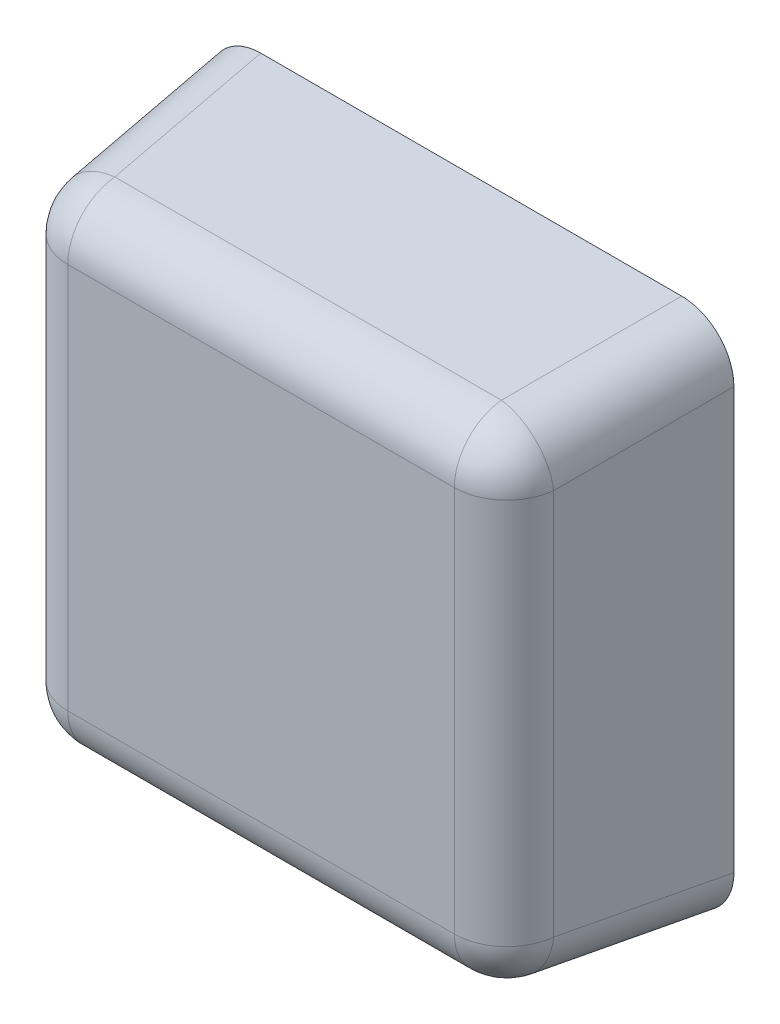
ISO-10303-21;
HEADER;
FILE_DESCRIPTION(('STEP AP214'),'2;1');
FILE_NAME('part.step','',(''),(''),'','','');
FILE_SCHEMA(('AUTOMOTIVE_DESIGN { 1 0 10303 214 1 1 1 1 }'));
ENDSEC;
DATA;
#1=APPLICATION_CONTEXT('core data for automotive mechanical design processes');
#2=APPLICATION_PROTOCOL_DEFINITION('international standard','automotive_design',2000,#1);
#3=PRODUCT_CONTEXT('',#1,'mechanical');
#4=PRODUCT('Part','Part','',(#3));
#5=PRODUCT_RELATED_PRODUCT_CATEGORY('part','',(#4));
#6=PRODUCT_DEFINITION_FORMATION('','',#4);
#7=PRODUCT_DEFINITION_CONTEXT('part definition',#1,'design');
#8=PRODUCT_DEFINITION('design','',#6,#7);
#9=PRODUCT_DEFINITION_SHAPE('','',#8);
#10=(LENGTH_UNIT() NAMED_UNIT(*) SI_UNIT(.MILLI.,.METRE.));
#11=(NAMED_UNIT(*) PLANE_ANGLE_UNIT() SI_UNIT($,.RADIAN.));
#12=(NAMED_UNIT(*) SI_UNIT($,.STERADIAN.) SOLID_ANGLE_UNIT());
#13=UNCERTAINTY_MEASURE_WITH_UNIT(LENGTH_MEASURE(1.E-05),#10,'distance_accuracy_value','');
#14=(GEOMETRIC_REPRESENTATION_CONTEXT(3) GLOBAL_UNCERTAINTY_ASSIGNED_CONTEXT((#13)) GLOBAL_UNIT_ASSIGNED_CONTEXT((#10,
#11,#12)) REPRESENTATION_CONTEXT('',''));
#15=CARTESIAN_POINT('',(0.,0.,0.));
#16=DIRECTION('',(0.,0.,1.));
#17=DIRECTION('',(1.,0.,0.));
#18=AXIS2_PLACEMENT_3D('',#15,#16,#17);
#19=CARTESIAN_POINT('',(0.,0.,0.));
#20=DIRECTION('',(-0.994521895368273,0.,0.104528463267653));
#21=DIRECTION('',(0.104528463267653,0.,0.994521895368273));
#22=AXIS2_PLACEMENT_3D('',#19,#20,#21);
#23=PLANE('',#22);
#24=DIRECTION('',(0.,-1.,0.));
#25=VECTOR('',#24,1.);
#26=CARTESIAN_POINT('',(0.,0.,0.));
#27=LINE('',#26,#25);
#28=CARTESIAN_POINT('',(0.,-1.26304280711771,0.));
#29=VERTEX_POINT('',#28);
#30=CARTESIAN_POINT('',(0.,-11.4369571928823,0.));
#31=VERTEX_POINT('',#30);
#32=EDGE_CURVE('E198',#29,#31,#27,.T.);
#33=ORIENTED_EDGE('',*,*,#32,.T.);
#34=DIRECTION('',(0.103962051184498,0.103962051184498,0.989132844377854));
#35=VECTOR('',#34,1.);
#36=CARTESIAN_POINT('',(0.123611869521211,-11.3133453233611,1.1760883774926));
#37=LINE('',#36,#35);
#38=CARTESIAN_POINT('',(0.414399844290188,-11.0225573485921,3.94275114834992));
#39=VERTEX_POINT('',#38);
#40=EDGE_CURVE('E50',#31,#39,#37,.T.);
#41=ORIENTED_EDGE('',*,*,#40,.T.);
#42=DIRECTION('',(0.,-1.,0.));
#43=VECTOR('',#42,1.);
#44=CARTESIAN_POINT('',(0.414399844290186,-0.533929515149637,3.94275114834992));
#45=LINE('',#44,#43);
#46=CARTESIAN_POINT('',(0.414399844290186,-1.67744265140789,3.94275114834992));
#47=VERTEX_POINT('',#46);
#48=EDGE_CURVE('E55',#39,#47,#45,.F.);
#49=ORIENTED_EDGE('',*,*,#48,.T.);
#50=DIRECTION('',(0.103962051184498,-0.103962051184498,0.989132844377854));
#51=VECTOR('',#50,1.);
#52=CARTESIAN_POINT('',(-0.0136511031771894,-1.24939170394052,-0.129881570829977));
#53=LINE('',#52,#51);
#54=EDGE_CURVE('E167',#47,#29,#53,.F.);
#55=ORIENTED_EDGE('',*,*,#54,.T.);
#56=EDGE_LOOP('',(#33,#41,#49,#55));
#57=FACE_BOUND('',#56,.T.);
#58=ADVANCED_FACE('F33',(#57),#23,.T.);
#59=CARTESIAN_POINT('',(0.,-12.7,0.));
#60=DIRECTION('',(0.,-0.994521895368273,0.104528463267653));
#61=DIRECTION('',(0.,-0.104528463267653,-0.994521895368273));
#62=AXIS2_PLACEMENT_3D('',#59,#60,#61);
#63=PLANE('',#62);
#64=DIRECTION('',(1.,0.,0.));
#65=VECTOR('',#64,1.);
#66=CARTESIAN_POINT('',(0.,-12.7,0.));
#67=LINE('',#66,#65);
#68=CARTESIAN_POINT('',(1.26304280711771,-12.7,0.));
#69=VERTEX_POINT('',#68);
#70=CARTESIAN_POINT('',(11.4369571928823,-12.7,0.));
#71=VERTEX_POINT('',#70);
#72=EDGE_CURVE('E200',#69,#71,#67,.T.);
#73=ORIENTED_EDGE('',*,*,#72,.T.);
#74=DIRECTION('',(-0.103962051184498,0.103962051184498,0.989132844377854));
#75=VECTOR('',#74,1.);
#76=CARTESIAN_POINT('',(11.3133453233611,-12.5763881304788,1.1760883774926));
#77=LINE('',#76,#75);
#78=CARTESIAN_POINT('',(11.0225573485921,-12.2856001557098,3.94275114834992));
#79=VERTEX_POINT('',#78);
#80=EDGE_CURVE('E165',#71,#79,#77,.T.);
#81=ORIENTED_EDGE('',*,*,#80,.T.);
#82=DIRECTION('',(1.,0.,0.));
#83=VECTOR('',#82,1.);
#84=CARTESIAN_POINT('',(0.533929515149638,-12.2856001557098,3.94275114834992));
#85=LINE('',#84,#83);
#86=CARTESIAN_POINT('',(1.67744265140789,-12.2856001557098,3.94275114834992));
#87=VERTEX_POINT('',#86);
#88=EDGE_CURVE('E163',#79,#87,#85,.F.);
#89=ORIENTED_EDGE('',*,*,#88,.T.);
#90=DIRECTION('',(0.103962051184498,0.103962051184498,0.989132844377854));
#91=VECTOR('',#90,1.);
#92=CARTESIAN_POINT('',(1.24939170394052,-12.7136511031772,-0.129881570829977));
#93=LINE('',#92,#91);
#94=EDGE_CURVE('E161',#87,#69,#93,.F.);
#95=ORIENTED_EDGE('',*,*,#94,.T.);
#96=EDGE_LOOP('',(#73,#81,#89,#95));
#97=FACE_BOUND('',#96,.T.);
#98=ADVANCED_FACE('F253',(#97),#63,.T.);
#99=CARTESIAN_POINT('',(12.7,0.,0.));
#100=DIRECTION('',(0.994521895368273,0.,0.104528463267653));
#101=DIRECTION('',(0.104528463267653,0.,-0.994521895368273));
#102=AXIS2_PLACEMENT_3D('',#99,#100,#101);
#103=PLANE('',#102);
#104=DIRECTION('',(0.,1.,0.));
#105=VECTOR('',#104,1.);
#106=CARTESIAN_POINT('',(12.2856001557098,-12.1660704848504,3.94275114834992));
#107=LINE('',#106,#105);
#108=CARTESIAN_POINT('',(12.2856001557098,-1.67744265140789,3.94275114834992));
#109=VERTEX_POINT('',#108);
#110=CARTESIAN_POINT('',(12.2856001557098,-11.0225573485921,3.94275114834992));
#111=VERTEX_POINT('',#110);
#112=EDGE_CURVE('E157',#109,#111,#107,.F.);
#113=ORIENTED_EDGE('',*,*,#112,.T.);
#114=DIRECTION('',(-0.103962051184498,0.103962051184498,0.989132844377854));
#115=VECTOR('',#114,1.);
#116=CARTESIAN_POINT('',(12.5763881304788,-11.3133453233611,1.1760883774926));
#117=LINE('',#116,#115);
#118=CARTESIAN_POINT('',(12.7,-11.4369571928823,0.));
#119=VERTEX_POINT('',#118);
#120=EDGE_CURVE('E159',#111,#119,#117,.F.);
#121=ORIENTED_EDGE('',*,*,#120,.T.);
#122=DIRECTION('',(0.,1.,0.));
#123=VECTOR('',#122,1.);
#124=CARTESIAN_POINT('',(12.7,0.,0.));
#125=LINE('',#124,#123);
#126=CARTESIAN_POINT('',(12.7,-1.26304280711771,0.));
#127=VERTEX_POINT('',#126);
#128=EDGE_CURVE('E204',#119,#127,#125,.T.);
#129=ORIENTED_EDGE('',*,*,#128,.T.);
#130=DIRECTION('',(-0.103962051184498,-0.103962051184498,0.989132844377854));
#131=VECTOR('',#130,1.);
#132=CARTESIAN_POINT('',(12.7136511031772,-1.24939170394052,-0.129881570829977));
#133=LINE('',#132,#131);
#134=EDGE_CURVE('E155',#127,#109,#133,.T.);
#135=ORIENTED_EDGE('',*,*,#134,.T.);
#136=EDGE_LOOP('',(#113,#121,#129,#135));
#137=FACE_BOUND('',#136,.T.);
#138=ADVANCED_FACE('F258',(#137),#103,.T.);
#139=CARTESIAN_POINT('',(0.,0.,0.));
#140=DIRECTION('',(0.,0.994521895368273,0.104528463267653));
#141=DIRECTION('',(0.,-0.104528463267653,0.994521895368273));
#142=AXIS2_PLACEMENT_3D('',#139,#140,#141);
#143=PLANE('',#142);
#144=DIRECTION('',(-1.,0.,0.));
#145=VECTOR('',#144,1.);
#146=CARTESIAN_POINT('',(0.,0.,0.));
#147=LINE('',#146,#145);
#148=CARTESIAN_POINT('',(11.4369571928823,0.,0.));
#149=VERTEX_POINT('',#148);
#150=CARTESIAN_POINT('',(1.26304280711771,0.,0.));
#151=VERTEX_POINT('',#150);
#152=EDGE_CURVE('E140',#149,#151,#147,.T.);
#153=ORIENTED_EDGE('',*,*,#152,.T.);
#154=DIRECTION('',(0.103962051184498,-0.103962051184498,0.989132844377854));
#155=VECTOR('',#154,1.);
#156=CARTESIAN_POINT('',(1.24939170394052,0.0136511031771896,-0.129881570829977));
#157=LINE('',#156,#155);
#158=CARTESIAN_POINT('',(1.67744265140789,-0.414399844290186,3.94275114834992));
#159=VERTEX_POINT('',#158);
#160=EDGE_CURVE('E153',#151,#159,#157,.T.);
#161=ORIENTED_EDGE('',*,*,#160,.T.);
#162=DIRECTION('',(-1.,0.,0.));
#163=VECTOR('',#162,1.);
#164=CARTESIAN_POINT('',(12.1660704848504,-0.414399844290186,3.94275114834992));
#165=LINE('',#164,#163);
#166=CARTESIAN_POINT('',(11.0225573485921,-0.414399844290186,3.94275114834992));
#167=VERTEX_POINT('',#166);
#168=EDGE_CURVE('E118',#159,#167,#165,.F.);
#169=ORIENTED_EDGE('',*,*,#168,.T.);
#170=DIRECTION('',(-0.103962051184498,-0.103962051184498,0.989132844377854));
#171=VECTOR('',#170,1.);
#172=CARTESIAN_POINT('',(11.3133453233611,-0.12361186952121,1.1760883774926));
#173=LINE('',#172,#171);
#174=EDGE_CURVE('E146',#167,#149,#173,.F.);
#175=ORIENTED_EDGE('',*,*,#174,.T.);
#176=EDGE_LOOP('',(#153,#161,#169,#175));
#177=FACE_BOUND('',#176,.T.);
#178=ADVANCED_FACE('F229',(#177),#143,.T.);
#179=CARTESIAN_POINT('',(0.,0.,5.08));
#180=DIRECTION('',(0.,0.,1.));
#181=DIRECTION('',(1.,0.,0.));
#182=AXIS2_PLACEMENT_3D('',#179,#180,#181);
#183=PLANE('',#182);
#184=DIRECTION('',(0.,-1.,0.));
#185=VECTOR('',#184,1.);
#186=CARTESIAN_POINT('',(11.0225573485921,-0.533929515149637,5.08));
#187=LINE('',#186,#185);
#188=CARTESIAN_POINT('',(11.0225573485921,-11.0225573485921,5.08));
#189=VERTEX_POINT('',#188);
#190=CARTESIAN_POINT('',(11.0225573485921,-1.67744265140789,5.08));
#191=VERTEX_POINT('',#190);
#192=EDGE_CURVE('E144',#189,#191,#187,.F.);
#193=ORIENTED_EDGE('',*,*,#192,.T.);
#194=DIRECTION('',(1.,0.,0.));
#195=VECTOR('',#194,1.);
#196=CARTESIAN_POINT('',(0.533929515149637,-1.67744265140789,5.08));
#197=LINE('',#196,#195);
#198=CARTESIAN_POINT('',(1.67744265140789,-1.67744265140789,5.08));
#199=VERTEX_POINT('',#198);
#200=EDGE_CURVE('E116',#191,#199,#197,.F.);
#201=ORIENTED_EDGE('',*,*,#200,.T.);
#202=DIRECTION('',(0.,1.,0.));
#203=VECTOR('',#202,1.);
#204=CARTESIAN_POINT('',(1.6774426514079,-12.1660704848504,5.08));
#205=LINE('',#204,#203);
#206=CARTESIAN_POINT('',(1.67744265140789,-11.0225573485921,5.08));
#207=VERTEX_POINT('',#206);
#208=EDGE_CURVE('E133',#199,#207,#205,.F.);
#209=ORIENTED_EDGE('',*,*,#208,.T.);
#210=DIRECTION('',(-1.,0.,0.));
#211=VECTOR('',#210,1.);
#212=CARTESIAN_POINT('',(12.1660704848504,-11.0225573485921,5.08));
#213=LINE('',#212,#211);
#214=EDGE_CURVE('E139',#207,#189,#213,.F.);
#215=ORIENTED_EDGE('',*,*,#214,.T.);
#216=EDGE_LOOP('',(#193,#201,#209,#215));
#217=FACE_BOUND('',#216,.T.);
#218=ADVANCED_FACE('F142',(#217),#183,.T.);
#219=CARTESIAN_POINT('',(0.,0.,0.));
#220=DIRECTION('',(0.,0.,1.));
#221=DIRECTION('',(1.,0.,0.));
#222=AXIS2_PLACEMENT_3D('',#219,#220,#221);
#223=PLANE('',#222);
#224=ORIENTED_EDGE('',*,*,#128,.F.);
#225=CARTESIAN_POINT('',(11.4230044849543,-11.4230044849543,0.));
#226=DIRECTION('',(0.,0.,1.));
#227=DIRECTION('',(0.707106781186548,-0.707106781186547,0.));
#228=AXIS2_PLACEMENT_3D('',#225,#226,#227);
#229=ELLIPSE('',#228,1.28395291615132,1.27);
#230=EDGE_CURVE('E11',#119,#71,#229,.F.);
#231=ORIENTED_EDGE('',*,*,#230,.T.);
#232=ORIENTED_EDGE('',*,*,#72,.F.);
#233=CARTESIAN_POINT('',(1.27699551504567,-11.4230044849543,0.));
#234=DIRECTION('',(0.,0.,1.));
#235=DIRECTION('',(-0.707106781186547,-0.707106781186548,0.));
#236=AXIS2_PLACEMENT_3D('',#233,#234,#235);
#237=ELLIPSE('',#236,1.28395291615132,1.27);
#238=EDGE_CURVE('E42',#69,#31,#237,.F.);
#239=ORIENTED_EDGE('',*,*,#238,.T.);
#240=ORIENTED_EDGE('',*,*,#32,.F.);
#241=CARTESIAN_POINT('',(1.27699551504567,-1.27699551504567,0.));
#242=DIRECTION('',(0.,0.,1.));
#243=DIRECTION('',(-0.707106781186548,0.707106781186547,0.));
#244=AXIS2_PLACEMENT_3D('',#241,#242,#243);
#245=ELLIPSE('',#244,1.28395291615132,1.27);
#246=EDGE_CURVE('E173',#29,#151,#245,.F.);
#247=ORIENTED_EDGE('',*,*,#246,.T.);
#248=ORIENTED_EDGE('',*,*,#152,.F.);
#249=CARTESIAN_POINT('',(11.4230044849543,-1.27699551504567,0.));
#250=DIRECTION('',(0.,0.,1.));
#251=DIRECTION('',(0.707106781186547,0.707106781186548,0.));
#252=AXIS2_PLACEMENT_3D('',#249,#250,#251);
#253=ELLIPSE('',#252,1.28395291615132,1.27);
#254=EDGE_CURVE('E171',#149,#127,#253,.F.);
#255=ORIENTED_EDGE('',*,*,#254,.T.);
#256=EDGE_LOOP('',(#224,#231,#232,#239,#240,#247,#248,#255));
#257=FACE_BOUND('',#256,.T.);
#258=ADVANCED_FACE('F236',(#257),#223,.F.);
#259=CARTESIAN_POINT('',(11.3133453233611,-11.3133453233611,1.04333722914268));
#260=DIRECTION('',(0.103962051184498,-0.103962051184498,-0.989132844377854));
#261=DIRECTION('',(-0.994521895368273,0.,-0.104528463267653));
#262=AXIS2_PLACEMENT_3D('',#259,#260,#261);
#263=CYLINDRICAL_SURFACE('',#262,1.27);
#264=ORIENTED_EDGE('',*,*,#230,.F.);
#265=ORIENTED_EDGE('',*,*,#120,.F.);
#266=CARTESIAN_POINT('',(11.0225573485921,-11.0225573485921,3.81));
#267=DIRECTION('',(-0.103962051184498,0.103962051184498,0.989132844377854));
#268=DIRECTION('',(0.994521895368273,0.,0.104528463267654));
#269=AXIS2_PLACEMENT_3D('',#266,#267,#268);
#270=CIRCLE('',#269,1.27);
#271=EDGE_CURVE('E37',#79,#111,#270,.T.);
#272=ORIENTED_EDGE('',*,*,#271,.F.);
#273=ORIENTED_EDGE('',*,*,#80,.F.);
#274=EDGE_LOOP('',(#264,#265,#272,#273));
#275=FACE_BOUND('',#274,.T.);
#276=ADVANCED_FACE('F35',(#275),#263,.T.);
#277=CARTESIAN_POINT('',(0.,-11.0225573485921,3.81));
#278=DIRECTION('',(1.,0.,0.));
#279=DIRECTION('',(0.,0.,-1.));
#280=AXIS2_PLACEMENT_3D('',#277,#278,#279);
#281=CYLINDRICAL_SURFACE('',#280,1.27);
#282=CARTESIAN_POINT('',(1.67744265140789,-11.0225573485921,3.81));
#283=DIRECTION('',(-1.,0.,0.));
#284=DIRECTION('',(0.,0.,1.));
#285=AXIS2_PLACEMENT_3D('',#282,#283,#284);
#286=CIRCLE('',#285,1.27);
#287=EDGE_CURVE('E190',#87,#207,#286,.T.);
#288=ORIENTED_EDGE('',*,*,#287,.F.);
#289=ORIENTED_EDGE('',*,*,#88,.F.);
#290=CARTESIAN_POINT('',(11.0225573485921,-11.0225573485921,3.81));
#291=DIRECTION('',(1.,0.,0.));
#292=DIRECTION('',(0.,1.,0.));
#293=AXIS2_PLACEMENT_3D('',#290,#291,#292);
#294=CIRCLE('',#293,1.27);
#295=EDGE_CURVE('E192',#189,#79,#294,.T.);
#296=ORIENTED_EDGE('',*,*,#295,.F.);
#297=ORIENTED_EDGE('',*,*,#214,.F.);
#298=EDGE_LOOP('',(#288,#289,#296,#297));
#299=FACE_BOUND('',#298,.T.);
#300=ADVANCED_FACE('F213',(#299),#281,.T.);
#301=CARTESIAN_POINT('',(1.24939170394052,-11.4506082960595,-0.262632719179897));
#302=DIRECTION('',(-0.103962051184498,-0.103962051184498,-0.989132844377854));
#303=DIRECTION('',(0.,0.994521895368273,-0.104528463267653));
#304=AXIS2_PLACEMENT_3D('',#301,#302,#303);
#305=CYLINDRICAL_SURFACE('',#304,1.27);
#306=ORIENTED_EDGE('',*,*,#238,.F.);
#307=ORIENTED_EDGE('',*,*,#94,.F.);
#308=CARTESIAN_POINT('',(1.67744265140789,-11.0225573485921,3.81));
#309=DIRECTION('',(0.103962051184498,0.103962051184498,0.989132844377854));
#310=DIRECTION('',(0.994521895368273,0.,-0.104528463267654));
#311=AXIS2_PLACEMENT_3D('',#308,#309,#310);
#312=CIRCLE('',#311,1.27);
#313=EDGE_CURVE('E187',#39,#87,#312,.T.);
#314=ORIENTED_EDGE('',*,*,#313,.F.);
#315=ORIENTED_EDGE('',*,*,#40,.F.);
#316=EDGE_LOOP('',(#306,#307,#314,#315));
#317=FACE_BOUND('',#316,.T.);
#318=ADVANCED_FACE('F241',(#317),#305,.T.);
#319=CARTESIAN_POINT('',(11.0225573485921,-11.0225573485921,3.81));
#320=DIRECTION('',(0.,0.,1.));
#321=DIRECTION('',(1.,0.,0.));
#322=AXIS2_PLACEMENT_3D('',#319,#320,#321);
#323=SPHERICAL_SURFACE('',#322,1.27);
#324=ORIENTED_EDGE('',*,*,#295,.T.);
#325=ORIENTED_EDGE('',*,*,#271,.T.);
#326=CARTESIAN_POINT('',(11.0225573485921,-11.0225573485921,3.81));
#327=DIRECTION('',(0.,-1.,0.));
#328=DIRECTION('',(0.,0.,-1.));
#329=AXIS2_PLACEMENT_3D('',#326,#327,#328);
#330=CIRCLE('',#329,1.27);
#331=EDGE_CURVE('E184',#189,#111,#330,.F.);
#332=ORIENTED_EDGE('',*,*,#331,.F.);
#333=EDGE_LOOP('',(#324,#325,#332));
#334=FACE_BOUND('',#333,.T.);
#335=ADVANCED_FACE('F214',(#334),#323,.T.);
#336=CARTESIAN_POINT('',(1.67744265140789,-11.0225573485921,3.81));
#337=DIRECTION('',(0.,0.,1.));
#338=DIRECTION('',(0.,-1.,0.));
#339=AXIS2_PLACEMENT_3D('',#336,#337,#338);
#340=SPHERICAL_SURFACE('',#339,1.27);
#341=ORIENTED_EDGE('',*,*,#313,.T.);
#342=ORIENTED_EDGE('',*,*,#287,.T.);
#343=CARTESIAN_POINT('',(1.67744265140789,-11.0225573485921,3.81));
#344=DIRECTION('',(0.,-1.,0.));
#345=DIRECTION('',(0.,0.,-1.));
#346=AXIS2_PLACEMENT_3D('',#343,#344,#345);
#347=CIRCLE('',#346,1.27);
#348=EDGE_CURVE('E136',#39,#207,#347,.F.);
#349=ORIENTED_EDGE('',*,*,#348,.F.);
#350=EDGE_LOOP('',(#341,#342,#349));
#351=FACE_BOUND('',#350,.T.);
#352=ADVANCED_FACE('F243',(#351),#340,.T.);
#353=CARTESIAN_POINT('',(11.3133453233611,-1.38665467663892,1.04333722914268));
#354=DIRECTION('',(0.103962051184498,0.103962051184498,-0.989132844377854));
#355=DIRECTION('',(0.,0.994521895368273,0.104528463267653));
#356=AXIS2_PLACEMENT_3D('',#353,#354,#355);
#357=CYLINDRICAL_SURFACE('',#356,1.27);
#358=ORIENTED_EDGE('',*,*,#254,.F.);
#359=ORIENTED_EDGE('',*,*,#174,.F.);
#360=CARTESIAN_POINT('',(11.0225573485921,-1.67744265140789,3.81));
#361=DIRECTION('',(-0.103962051184498,-0.103962051184498,0.989132844377854));
#362=DIRECTION('',(0.,-0.994521895368273,-0.104528463267654));
#363=AXIS2_PLACEMENT_3D('',#360,#361,#362);
#364=CIRCLE('',#363,1.27);
#365=EDGE_CURVE('E180',#109,#167,#364,.T.);
#366=ORIENTED_EDGE('',*,*,#365,.F.);
#367=ORIENTED_EDGE('',*,*,#134,.F.);
#368=EDGE_LOOP('',(#358,#359,#366,#367));
#369=FACE_BOUND('',#368,.T.);
#370=ADVANCED_FACE('F226',(#369),#357,.T.);
#371=CARTESIAN_POINT('',(11.0225573485921,0.,3.81));
#372=DIRECTION('',(0.,1.,0.));
#373=DIRECTION('',(-1.,0.,0.));
#374=AXIS2_PLACEMENT_3D('',#371,#372,#373);
#375=CYLINDRICAL_SURFACE('',#374,1.27);
#376=ORIENTED_EDGE('',*,*,#331,.T.);
#377=ORIENTED_EDGE('',*,*,#112,.F.);
#378=CARTESIAN_POINT('',(11.0225573485921,-1.67744265140789,3.81));
#379=DIRECTION('',(0.,1.,0.));
#380=DIRECTION('',(-1.,0.,0.));
#381=AXIS2_PLACEMENT_3D('',#378,#379,#380);
#382=CIRCLE('',#381,1.27);
#383=EDGE_CURVE('E130',#191,#109,#382,.T.);
#384=ORIENTED_EDGE('',*,*,#383,.F.);
#385=ORIENTED_EDGE('',*,*,#192,.F.);
#386=EDGE_LOOP('',(#376,#377,#384,#385));
#387=FACE_BOUND('',#386,.T.);
#388=ADVANCED_FACE('F217',(#387),#375,.T.);
#389=CARTESIAN_POINT('',(1.67744265140789,0.,3.81));
#390=DIRECTION('',(0.,-1.,0.));
#391=DIRECTION('',(1.,0.,0.));
#392=AXIS2_PLACEMENT_3D('',#389,#390,#391);
#393=CYLINDRICAL_SURFACE('',#392,1.27);
#394=ORIENTED_EDGE('',*,*,#348,.T.);
#395=ORIENTED_EDGE('',*,*,#208,.F.);
#396=CARTESIAN_POINT('',(1.67744265140789,-1.67744265140789,3.81));
#397=DIRECTION('',(0.,1.,0.));
#398=DIRECTION('',(0.,0.,1.));
#399=AXIS2_PLACEMENT_3D('',#396,#397,#398);
#400=CIRCLE('',#399,1.27);
#401=EDGE_CURVE('E124',#47,#199,#400,.T.);
#402=ORIENTED_EDGE('',*,*,#401,.F.);
#403=ORIENTED_EDGE('',*,*,#48,.F.);
#404=EDGE_LOOP('',(#394,#395,#402,#403));
#405=FACE_BOUND('',#404,.T.);
#406=ADVANCED_FACE('F134',(#405),#393,.T.);
#407=CARTESIAN_POINT('',(1.24939170394052,-1.24939170394052,-0.262632719179897));
#408=DIRECTION('',(-0.103962051184498,0.103962051184498,-0.989132844377854));
#409=DIRECTION('',(-0.994521895368273,0.,0.104528463267653));
#410=AXIS2_PLACEMENT_3D('',#407,#408,#409);
#411=CYLINDRICAL_SURFACE('',#410,1.27);
#412=ORIENTED_EDGE('',*,*,#246,.F.);
#413=ORIENTED_EDGE('',*,*,#54,.F.);
#414=CARTESIAN_POINT('',(1.67744265140789,-1.67744265140789,3.81));
#415=DIRECTION('',(0.103962051184498,-0.103962051184498,0.989132844377854));
#416=DIRECTION('',(0.994521895368273,0.,-0.104528463267654));
#417=AXIS2_PLACEMENT_3D('',#414,#415,#416);
#418=CIRCLE('',#417,1.27);
#419=EDGE_CURVE('E128',#159,#47,#418,.T.);
#420=ORIENTED_EDGE('',*,*,#419,.F.);
#421=ORIENTED_EDGE('',*,*,#160,.F.);
#422=EDGE_LOOP('',(#412,#413,#420,#421));
#423=FACE_BOUND('',#422,.T.);
#424=ADVANCED_FACE('F233',(#423),#411,.T.);
#425=CARTESIAN_POINT('',(11.0225573485921,-1.67744265140789,3.81));
#426=DIRECTION('',(0.,0.,1.));
#427=DIRECTION('',(1.,0.,0.));
#428=AXIS2_PLACEMENT_3D('',#425,#426,#427);
#429=SPHERICAL_SURFACE('',#428,1.27);
#430=ORIENTED_EDGE('',*,*,#383,.T.);
#431=ORIENTED_EDGE('',*,*,#365,.T.);
#432=CARTESIAN_POINT('',(11.0225573485921,-1.67744265140789,3.81));
#433=DIRECTION('',(1.,0.,0.));
#434=DIRECTION('',(0.,0.,-1.));
#435=AXIS2_PLACEMENT_3D('',#432,#433,#434);
#436=CIRCLE('',#435,1.27);
#437=EDGE_CURVE('E121',#191,#167,#436,.F.);
#438=ORIENTED_EDGE('',*,*,#437,.F.);
#439=EDGE_LOOP('',(#430,#431,#438));
#440=FACE_BOUND('',#439,.T.);
#441=ADVANCED_FACE('F221',(#440),#429,.T.);
#442=CARTESIAN_POINT('',(1.67744265140789,-1.67744265140789,3.81));
#443=DIRECTION('',(0.,0.,1.));
#444=DIRECTION('',(1.,0.,0.));
#445=AXIS2_PLACEMENT_3D('',#442,#443,#444);
#446=SPHERICAL_SURFACE('',#445,1.27);
#447=ORIENTED_EDGE('',*,*,#419,.T.);
#448=ORIENTED_EDGE('',*,*,#401,.T.);
#449=CARTESIAN_POINT('',(1.67744265140789,-1.67744265140789,3.81));
#450=DIRECTION('',(-1.,0.,0.));
#451=DIRECTION('',(0.,0.,1.));
#452=AXIS2_PLACEMENT_3D('',#449,#450,#451);
#453=CIRCLE('',#452,1.27);
#454=EDGE_CURVE('E112',#159,#199,#453,.F.);
#455=ORIENTED_EDGE('',*,*,#454,.F.);
#456=EDGE_LOOP('',(#447,#448,#455));
#457=FACE_BOUND('',#456,.T.);
#458=ADVANCED_FACE('F126',(#457),#446,.T.);
#459=CARTESIAN_POINT('',(0.,-1.67744265140789,3.81));
#460=DIRECTION('',(-1.,0.,0.));
#461=DIRECTION('',(0.,0.,1.));
#462=AXIS2_PLACEMENT_3D('',#459,#460,#461);
#463=CYLINDRICAL_SURFACE('',#462,1.27);
#464=ORIENTED_EDGE('',*,*,#437,.T.);
#465=ORIENTED_EDGE('',*,*,#168,.F.);
#466=ORIENTED_EDGE('',*,*,#454,.T.);
#467=ORIENTED_EDGE('',*,*,#200,.F.);
#468=EDGE_LOOP('',(#464,#465,#466,#467));
#469=FACE_BOUND('',#468,.T.);
#470=ADVANCED_FACE('F114',(#469),#463,.T.);
#471=CLOSED_SHELL('',(#58,#98,#138,#178,#218,#258,#276,#300,#318,#335,#352,#370,#388,#406,#424,
#441,#458,#470));
#472=MANIFOLD_SOLID_BREP('B2',#471);
#473=ADVANCED_BREP_SHAPE_REPRESENTATION('',(#18,#472),#14);
#474=SHAPE_DEFINITION_REPRESENTATION(#9,#473);
ENDSEC;
END-ISO-10303-21;
